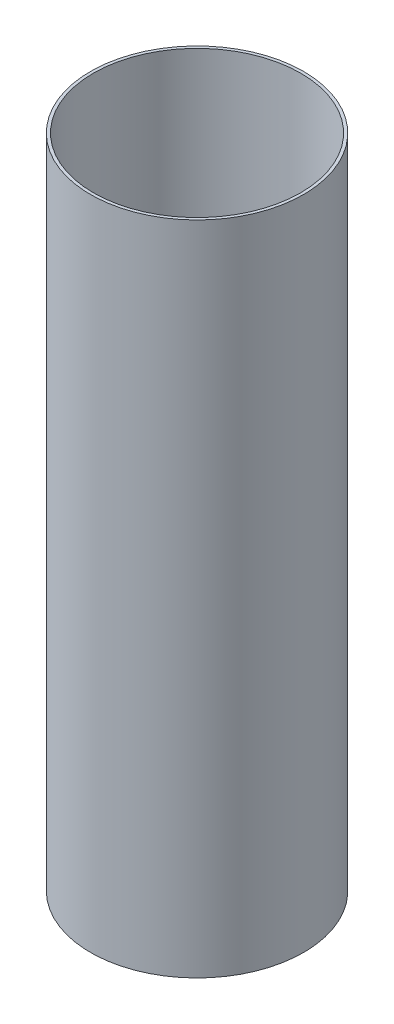
ISO-10303-21;
HEADER;
FILE_DESCRIPTION(('STEP AP214'),'2;1');
FILE_NAME('part.step','',(''),(''),'','','');
FILE_SCHEMA(('AUTOMOTIVE_DESIGN { 1 0 10303 214 1 1 1 1 }'));
ENDSEC;
DATA;
#1=APPLICATION_CONTEXT('core data for automotive mechanical design processes');
#2=APPLICATION_PROTOCOL_DEFINITION('international standard','automotive_design',2000,#1);
#3=PRODUCT_CONTEXT('',#1,'mechanical');
#4=PRODUCT('Part','Part','',(#3));
#5=PRODUCT_RELATED_PRODUCT_CATEGORY('part','',(#4));
#6=PRODUCT_DEFINITION_FORMATION('','',#4);
#7=PRODUCT_DEFINITION_CONTEXT('part definition',#1,'design');
#8=PRODUCT_DEFINITION('design','',#6,#7);
#9=PRODUCT_DEFINITION_SHAPE('','',#8);
#10=(LENGTH_UNIT() NAMED_UNIT(*) SI_UNIT(.MILLI.,.METRE.));
#11=(NAMED_UNIT(*) PLANE_ANGLE_UNIT() SI_UNIT($,.RADIAN.));
#12=(NAMED_UNIT(*) SI_UNIT($,.STERADIAN.) SOLID_ANGLE_UNIT());
#13=UNCERTAINTY_MEASURE_WITH_UNIT(LENGTH_MEASURE(1.E-05),#10,'distance_accuracy_value','');
#14=(GEOMETRIC_REPRESENTATION_CONTEXT(3) GLOBAL_UNCERTAINTY_ASSIGNED_CONTEXT((#13)) GLOBAL_UNIT_ASSIGNED_CONTEXT((#10,
#11,#12)) REPRESENTATION_CONTEXT('',''));
#15=CARTESIAN_POINT('',(0.,0.,0.));
#16=DIRECTION('',(0.,0.,1.));
#17=DIRECTION('',(1.,0.,0.));
#18=AXIS2_PLACEMENT_3D('',#15,#16,#17);
#19=CARTESIAN_POINT('',(0.,482.6,0.));
#20=DIRECTION('',(0.,1.,0.));
#21=DIRECTION('',(0.,0.,1.));
#22=AXIS2_PLACEMENT_3D('',#19,#20,#21);
#23=PLANE('',#22);
#24=CARTESIAN_POINT('',(0.,482.6,0.));
#25=DIRECTION('',(0.,1.,0.));
#26=DIRECTION('',(0.,0.,1.));
#27=AXIS2_PLACEMENT_3D('',#24,#25,#26);
#28=CIRCLE('',#27,78.359);
#29=CARTESIAN_POINT('',(0.,482.6,-78.359));
#30=VERTEX_POINT('',#29);
#31=EDGE_CURVE('E10',#30,#30,#28,.T.);
#32=ORIENTED_EDGE('',*,*,#31,.T.);
#33=EDGE_LOOP('',(#32));
#34=FACE_BOUND('',#33,.T.);
#35=CARTESIAN_POINT('',(0.,482.6,0.));
#36=DIRECTION('',(0.,1.,0.));
#37=DIRECTION('',(0.,0.,1.));
#38=AXIS2_PLACEMENT_3D('',#35,#36,#37);
#39=CIRCLE('',#38,76.2);
#40=CARTESIAN_POINT('',(0.,482.6,-76.2));
#41=VERTEX_POINT('',#40);
#42=EDGE_CURVE('E48',#41,#41,#39,.T.);
#43=ORIENTED_EDGE('',*,*,#42,.F.);
#44=EDGE_LOOP('',(#43));
#45=FACE_BOUND('',#44,.T.);
#46=ADVANCED_FACE('F40',(#34,#45),#23,.T.);
#47=CARTESIAN_POINT('',(0.,0.,0.));
#48=DIRECTION('',(0.,1.,0.));
#49=DIRECTION('',(0.,0.,1.));
#50=AXIS2_PLACEMENT_3D('',#47,#48,#49);
#51=PLANE('',#50);
#52=CARTESIAN_POINT('',(0.,0.,0.));
#53=DIRECTION('',(0.,1.,0.));
#54=DIRECTION('',(0.,0.,1.));
#55=AXIS2_PLACEMENT_3D('',#52,#53,#54);
#56=CIRCLE('',#55,78.359);
#57=CARTESIAN_POINT('',(0.,0.,-78.359));
#58=VERTEX_POINT('',#57);
#59=EDGE_CURVE('E41',#58,#58,#56,.T.);
#60=ORIENTED_EDGE('',*,*,#59,.F.);
#61=EDGE_LOOP('',(#60));
#62=FACE_BOUND('',#61,.T.);
#63=CARTESIAN_POINT('',(0.,0.,0.));
#64=DIRECTION('',(0.,1.,0.));
#65=DIRECTION('',(0.,0.,1.));
#66=AXIS2_PLACEMENT_3D('',#63,#64,#65);
#67=CIRCLE('',#66,76.2);
#68=CARTESIAN_POINT('',(0.,0.,-76.2));
#69=VERTEX_POINT('',#68);
#70=EDGE_CURVE('E49',#69,#69,#67,.T.);
#71=ORIENTED_EDGE('',*,*,#70,.T.);
#72=EDGE_LOOP('',(#71));
#73=FACE_BOUND('',#72,.T.);
#74=ADVANCED_FACE('F58',(#62,#73),#51,.F.);
#75=CARTESIAN_POINT('',(0.,482.6,0.));
#76=DIRECTION('',(0.,-1.,0.));
#77=DIRECTION('',(0.,0.,-1.));
#78=AXIS2_PLACEMENT_3D('',#75,#76,#77);
#79=CYLINDRICAL_SURFACE('',#78,78.359);
#80=CARTESIAN_POINT('',(0.,482.6,-78.359));
#81=CARTESIAN_POINT('',(0.,477.572916666667,-78.359));
#82=CARTESIAN_POINT('',(0.,472.545833333333,-78.359));
#83=CARTESIAN_POINT('',(0.,462.491666666667,-78.359));
#84=CARTESIAN_POINT('',(0.,457.464583333333,-78.359));
#85=CARTESIAN_POINT('',(0.,447.410416666667,-78.359));
#86=CARTESIAN_POINT('',(0.,442.383333333333,-78.359));
#87=CARTESIAN_POINT('',(0.,432.329166666667,-78.359));
#88=CARTESIAN_POINT('',(0.,427.302083333333,-78.359));
#89=CARTESIAN_POINT('',(0.,417.247916666667,-78.359));
#90=CARTESIAN_POINT('',(0.,412.220833333333,-78.359));
#91=CARTESIAN_POINT('',(0.,402.166666666667,-78.359));
#92=CARTESIAN_POINT('',(0.,397.139583333333,-78.359));
#93=CARTESIAN_POINT('',(0.,387.085416666667,-78.359));
#94=CARTESIAN_POINT('',(0.,382.058333333333,-78.359));
#95=CARTESIAN_POINT('',(0.,372.004166666667,-78.359));
#96=CARTESIAN_POINT('',(0.,366.977083333333,-78.359));
#97=CARTESIAN_POINT('',(0.,356.922916666667,-78.359));
#98=CARTESIAN_POINT('',(0.,351.895833333333,-78.359));
#99=CARTESIAN_POINT('',(0.,341.841666666667,-78.359));
#100=CARTESIAN_POINT('',(0.,336.814583333333,-78.359));
#101=CARTESIAN_POINT('',(0.,326.760416666667,-78.359));
#102=CARTESIAN_POINT('',(0.,321.733333333333,-78.359));
#103=CARTESIAN_POINT('',(0.,311.679166666667,-78.359));
#104=CARTESIAN_POINT('',(0.,306.652083333333,-78.359));
#105=CARTESIAN_POINT('',(0.,296.597916666667,-78.359));
#106=CARTESIAN_POINT('',(0.,291.570833333333,-78.359));
#107=CARTESIAN_POINT('',(0.,281.516666666667,-78.359));
#108=CARTESIAN_POINT('',(0.,276.489583333333,-78.359));
#109=CARTESIAN_POINT('',(0.,266.435416666667,-78.359));
#110=CARTESIAN_POINT('',(0.,261.408333333333,-78.359));
#111=CARTESIAN_POINT('',(0.,251.354166666667,-78.359));
#112=CARTESIAN_POINT('',(0.,246.327083333333,-78.359));
#113=CARTESIAN_POINT('',(0.,236.272916666667,-78.359));
#114=CARTESIAN_POINT('',(0.,231.245833333333,-78.359));
#115=CARTESIAN_POINT('',(0.,221.191666666667,-78.359));
#116=CARTESIAN_POINT('',(0.,216.164583333333,-78.359));
#117=CARTESIAN_POINT('',(0.,206.110416666667,-78.359));
#118=CARTESIAN_POINT('',(0.,201.083333333333,-78.359));
#119=CARTESIAN_POINT('',(0.,191.029166666667,-78.359));
#120=CARTESIAN_POINT('',(0.,186.002083333333,-78.359));
#121=CARTESIAN_POINT('',(0.,175.947916666667,-78.359));
#122=CARTESIAN_POINT('',(0.,170.920833333333,-78.359));
#123=CARTESIAN_POINT('',(0.,160.866666666667,-78.359));
#124=CARTESIAN_POINT('',(0.,155.839583333333,-78.359));
#125=CARTESIAN_POINT('',(0.,145.785416666667,-78.359));
#126=CARTESIAN_POINT('',(0.,140.758333333333,-78.359));
#127=CARTESIAN_POINT('',(0.,130.704166666667,-78.359));
#128=CARTESIAN_POINT('',(0.,125.677083333333,-78.359));
#129=CARTESIAN_POINT('',(0.,115.622916666667,-78.359));
#130=CARTESIAN_POINT('',(0.,110.595833333333,-78.359));
#131=CARTESIAN_POINT('',(0.,100.541666666667,-78.359));
#132=CARTESIAN_POINT('',(0.,95.5145833333333,-78.359));
#133=CARTESIAN_POINT('',(0.,85.4604166666667,-78.359));
#134=CARTESIAN_POINT('',(0.,80.4333333333333,-78.359));
#135=CARTESIAN_POINT('',(0.,70.3791666666667,-78.359));
#136=CARTESIAN_POINT('',(0.,65.3520833333334,-78.359));
#137=CARTESIAN_POINT('',(0.,55.2979166666667,-78.359));
#138=CARTESIAN_POINT('',(0.,50.2708333333333,-78.359));
#139=CARTESIAN_POINT('',(0.,40.2166666666666,-78.359));
#140=CARTESIAN_POINT('',(0.,35.1895833333333,-78.359));
#141=CARTESIAN_POINT('',(0.,25.1354166666667,-78.359));
#142=CARTESIAN_POINT('',(0.,20.1083333333333,-78.359));
#143=CARTESIAN_POINT('',(0.,10.0541666666667,-78.359));
#144=CARTESIAN_POINT('',(0.,5.02708333333333,-78.359));
#145=CARTESIAN_POINT('',(0.,0.,-78.359));
#146=B_SPLINE_CURVE_WITH_KNOTS('',3,(#80,#81,#82,#83,#84,#85,#86,#87,#88,#89,#90,#91,#92,#93,
#94,#95,#96,#97,#98,#99,#100,#101,#102,#103,#104,#105,#106,#107,#108,#109,#110,#111,#112,#113,
#114,#115,#116,#117,#118,#119,#120,#121,#122,#123,#124,#125,#126,#127,#128,#129,#130,#131,#132,
#133,#134,#135,#136,#137,#138,#139,#140,#141,#142,#143,#144,#145),.UNSPECIFIED.,.F.,.F.,(4,2,2,
2,2,2,2,2,2,2,2,2,2,2,2,2,2,2,2,2,2,2,2,2,2,2,2,2,2,2,2,2,4),(0.,15.08125,30.1625,45.24375,
60.325,75.40625,90.4874999999999,105.56875,120.65,135.73125,150.8125,165.89375,180.975,
196.05625,211.1375,226.21875,241.3,256.38125,271.4625,286.54375,301.625,316.70625,331.7875,
346.86875,361.95,377.03125,392.1125,407.19375,422.275,437.35625,452.4375,467.51875,482.6),.UNSPECIFIED.);
#147=EDGE_CURVE('BSEAM39',#30,#58,#146,.T.);
#148=ORIENTED_EDGE('',*,*,#31,.F.);
#149=ORIENTED_EDGE('',*,*,#59,.T.);
#150=ORIENTED_EDGE('',*,*,#147,.T.);
#151=ORIENTED_EDGE('',*,*,#147,.F.);
#152=EDGE_LOOP('',(#148,#150,#149,#151));
#153=FACE_BOUND('',#152,.T.);
#154=ADVANCED_FACE('F39',(#153),#79,.T.);
#155=CARTESIAN_POINT('',(0.,482.6,0.));
#156=DIRECTION('',(0.,-1.,0.));
#157=DIRECTION('',(0.,0.,-1.));
#158=AXIS2_PLACEMENT_3D('',#155,#156,#157);
#159=CYLINDRICAL_SURFACE('',#158,76.2);
#160=CARTESIAN_POINT('',(0.,482.6,-76.2));
#161=CARTESIAN_POINT('',(0.,477.572916666667,-76.2));
#162=CARTESIAN_POINT('',(0.,472.545833333333,-76.2));
#163=CARTESIAN_POINT('',(0.,462.491666666667,-76.2));
#164=CARTESIAN_POINT('',(0.,457.464583333333,-76.2));
#165=CARTESIAN_POINT('',(0.,447.410416666667,-76.2));
#166=CARTESIAN_POINT('',(0.,442.383333333333,-76.2));
#167=CARTESIAN_POINT('',(0.,432.329166666667,-76.2));
#168=CARTESIAN_POINT('',(0.,427.302083333333,-76.2));
#169=CARTESIAN_POINT('',(0.,417.247916666667,-76.2));
#170=CARTESIAN_POINT('',(0.,412.220833333333,-76.2));
#171=CARTESIAN_POINT('',(0.,402.166666666667,-76.2));
#172=CARTESIAN_POINT('',(0.,397.139583333333,-76.2));
#173=CARTESIAN_POINT('',(0.,387.085416666667,-76.2));
#174=CARTESIAN_POINT('',(0.,382.058333333333,-76.2));
#175=CARTESIAN_POINT('',(0.,372.004166666667,-76.2));
#176=CARTESIAN_POINT('',(0.,366.977083333333,-76.2));
#177=CARTESIAN_POINT('',(0.,356.922916666667,-76.2));
#178=CARTESIAN_POINT('',(0.,351.895833333333,-76.2));
#179=CARTESIAN_POINT('',(0.,341.841666666667,-76.2));
#180=CARTESIAN_POINT('',(0.,336.814583333333,-76.2));
#181=CARTESIAN_POINT('',(0.,326.760416666667,-76.2));
#182=CARTESIAN_POINT('',(0.,321.733333333333,-76.2));
#183=CARTESIAN_POINT('',(0.,311.679166666667,-76.2));
#184=CARTESIAN_POINT('',(0.,306.652083333333,-76.2));
#185=CARTESIAN_POINT('',(0.,296.597916666667,-76.2));
#186=CARTESIAN_POINT('',(0.,291.570833333333,-76.2));
#187=CARTESIAN_POINT('',(0.,281.516666666667,-76.2));
#188=CARTESIAN_POINT('',(0.,276.489583333333,-76.2));
#189=CARTESIAN_POINT('',(0.,266.435416666667,-76.2));
#190=CARTESIAN_POINT('',(0.,261.408333333333,-76.2));
#191=CARTESIAN_POINT('',(0.,251.354166666667,-76.2));
#192=CARTESIAN_POINT('',(0.,246.327083333333,-76.2));
#193=CARTESIAN_POINT('',(0.,236.272916666667,-76.2));
#194=CARTESIAN_POINT('',(0.,231.245833333333,-76.2));
#195=CARTESIAN_POINT('',(0.,221.191666666667,-76.2));
#196=CARTESIAN_POINT('',(0.,216.164583333333,-76.2));
#197=CARTESIAN_POINT('',(0.,206.110416666667,-76.2));
#198=CARTESIAN_POINT('',(0.,201.083333333333,-76.2));
#199=CARTESIAN_POINT('',(0.,191.029166666667,-76.2));
#200=CARTESIAN_POINT('',(0.,186.002083333333,-76.2));
#201=CARTESIAN_POINT('',(0.,175.947916666667,-76.2));
#202=CARTESIAN_POINT('',(0.,170.920833333333,-76.2));
#203=CARTESIAN_POINT('',(0.,160.866666666667,-76.2));
#204=CARTESIAN_POINT('',(0.,155.839583333333,-76.2));
#205=CARTESIAN_POINT('',(0.,145.785416666667,-76.2));
#206=CARTESIAN_POINT('',(0.,140.758333333333,-76.2));
#207=CARTESIAN_POINT('',(0.,130.704166666667,-76.2));
#208=CARTESIAN_POINT('',(0.,125.677083333333,-76.2));
#209=CARTESIAN_POINT('',(0.,115.622916666667,-76.2));
#210=CARTESIAN_POINT('',(0.,110.595833333333,-76.2));
#211=CARTESIAN_POINT('',(0.,100.541666666667,-76.2));
#212=CARTESIAN_POINT('',(0.,95.5145833333333,-76.2));
#213=CARTESIAN_POINT('',(0.,85.4604166666667,-76.2));
#214=CARTESIAN_POINT('',(0.,80.4333333333333,-76.2));
#215=CARTESIAN_POINT('',(0.,70.3791666666667,-76.2));
#216=CARTESIAN_POINT('',(0.,65.3520833333334,-76.2));
#217=CARTESIAN_POINT('',(0.,55.2979166666667,-76.2));
#218=CARTESIAN_POINT('',(0.,50.2708333333333,-76.2));
#219=CARTESIAN_POINT('',(0.,40.2166666666666,-76.2));
#220=CARTESIAN_POINT('',(0.,35.1895833333333,-76.2));
#221=CARTESIAN_POINT('',(0.,25.1354166666667,-76.2));
#222=CARTESIAN_POINT('',(0.,20.1083333333333,-76.2));
#223=CARTESIAN_POINT('',(0.,10.0541666666667,-76.2));
#224=CARTESIAN_POINT('',(0.,5.02708333333333,-76.2));
#225=CARTESIAN_POINT('',(0.,0.,-76.2));
#226=B_SPLINE_CURVE_WITH_KNOTS('',3,(#160,#161,#162,#163,#164,#165,#166,#167,#168,#169,#170,
#171,#172,#173,#174,#175,#176,#177,#178,#179,#180,#181,#182,#183,#184,#185,#186,#187,#188,#189,
#190,#191,#192,#193,#194,#195,#196,#197,#198,#199,#200,#201,#202,#203,#204,#205,#206,#207,#208,
#209,#210,#211,#212,#213,#214,#215,#216,#217,#218,#219,#220,#221,#222,#223,#224,#225),
.UNSPECIFIED.,.F.,.F.,(4,2,2,2,2,2,2,2,2,2,2,2,2,2,2,2,2,2,2,2,2,2,2,2,2,2,2,2,2,2,2,2,4),(0.,
15.08125,30.1625,45.24375,60.325,75.40625,90.4874999999999,105.56875,120.65,135.73125,150.8125,
165.89375,180.975,196.05625,211.1375,226.21875,241.3,256.38125,271.4625,286.54375,301.625,
316.70625,331.7875,346.86875,361.95,377.03125,392.1125,407.19375,422.275,437.35625,452.4375,
467.51875,482.6),.UNSPECIFIED.);
#227=EDGE_CURVE('BSEAM57',#41,#69,#226,.T.);
#228=ORIENTED_EDGE('',*,*,#42,.T.);
#229=ORIENTED_EDGE('',*,*,#70,.F.);
#230=ORIENTED_EDGE('',*,*,#227,.T.);
#231=ORIENTED_EDGE('',*,*,#227,.F.);
#232=EDGE_LOOP('',(#228,#230,#229,#231));
#233=FACE_BOUND('',#232,.T.);
#234=ADVANCED_FACE('F57',(#233),#159,.F.);
#235=CLOSED_SHELL('',(#46,#74,#154,#234));
#236=MANIFOLD_SOLID_BREP('B2',#235);
#237=ADVANCED_BREP_SHAPE_REPRESENTATION('',(#18,#236),#14);
#238=SHAPE_DEFINITION_REPRESENTATION(#9,#237);
ENDSEC;
END-ISO-10303-21;
